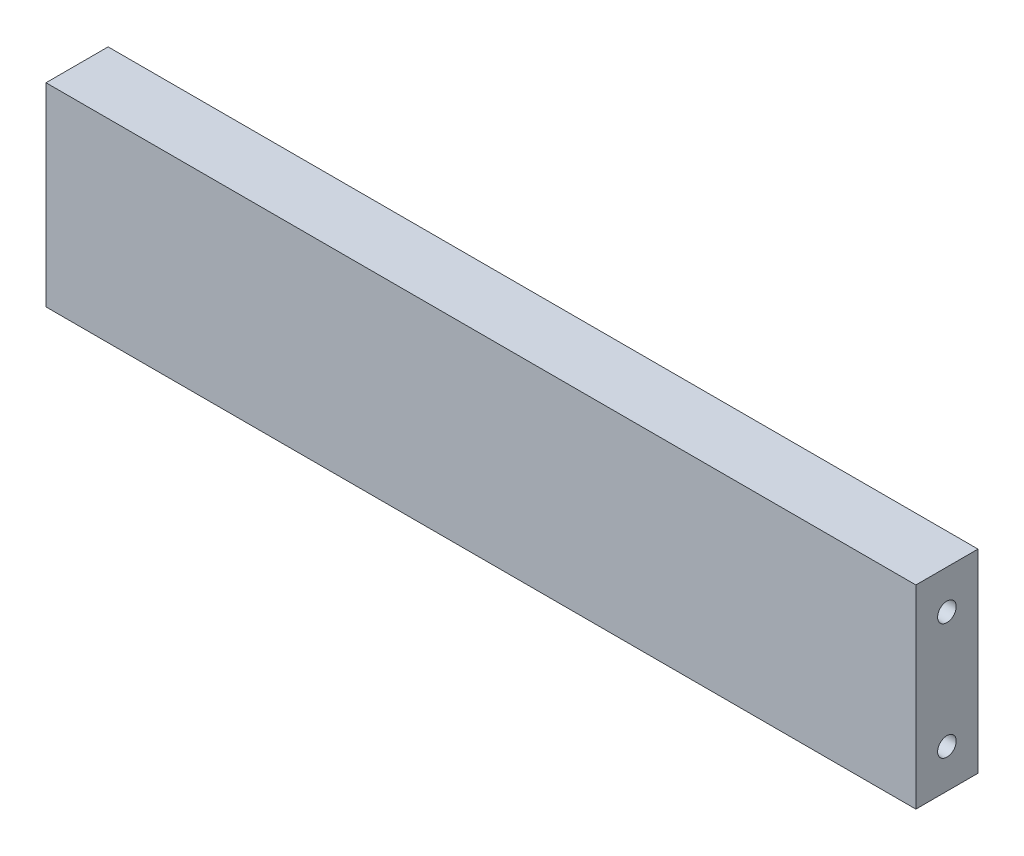
ISO-10303-21;
HEADER;
FILE_DESCRIPTION(('STEP AP214'),'2;1');
FILE_NAME('part.step','',(''),(''),'','','');
FILE_SCHEMA(('AUTOMOTIVE_DESIGN { 1 0 10303 214 1 1 1 1 }'));
ENDSEC;
DATA;
#1=APPLICATION_CONTEXT('core data for automotive mechanical design processes');
#2=APPLICATION_PROTOCOL_DEFINITION('international standard','automotive_design',2000,#1);
#3=PRODUCT_CONTEXT('',#1,'mechanical');
#4=PRODUCT('Part','Part','',(#3));
#5=PRODUCT_RELATED_PRODUCT_CATEGORY('part','',(#4));
#6=PRODUCT_DEFINITION_FORMATION('','',#4);
#7=PRODUCT_DEFINITION_CONTEXT('part definition',#1,'design');
#8=PRODUCT_DEFINITION('design','',#6,#7);
#9=PRODUCT_DEFINITION_SHAPE('','',#8);
#10=(LENGTH_UNIT() NAMED_UNIT(*) SI_UNIT(.MILLI.,.METRE.));
#11=(NAMED_UNIT(*) PLANE_ANGLE_UNIT() SI_UNIT($,.RADIAN.));
#12=(NAMED_UNIT(*) SI_UNIT($,.STERADIAN.) SOLID_ANGLE_UNIT());
#13=UNCERTAINTY_MEASURE_WITH_UNIT(LENGTH_MEASURE(1.E-05),#10,'distance_accuracy_value','');
#14=(GEOMETRIC_REPRESENTATION_CONTEXT(3) GLOBAL_UNCERTAINTY_ASSIGNED_CONTEXT((#13)) GLOBAL_UNIT_ASSIGNED_CONTEXT((#10,
#11,#12)) REPRESENTATION_CONTEXT('',''));
#15=CARTESIAN_POINT('',(0.,0.,0.));
#16=DIRECTION('',(0.,0.,1.));
#17=DIRECTION('',(1.,0.,0.));
#18=AXIS2_PLACEMENT_3D('',#15,#16,#17);
#19=CARTESIAN_POINT('',(0.,0.,8.));
#20=DIRECTION('',(-1.,0.,0.));
#21=DIRECTION('',(0.,-1.,0.));
#22=AXIS2_PLACEMENT_3D('',#19,#20,#21);
#23=PLANE('',#22);
#24=CARTESIAN_POINT('',(0.,5.00000000000002,4.));
#25=DIRECTION('',(-1.,0.,0.));
#26=DIRECTION('',(0.,-1.,0.));
#27=AXIS2_PLACEMENT_3D('',#24,#25,#26);
#28=CIRCLE('',#27,1.2);
#29=CARTESIAN_POINT('',(0.,3.80000000000002,4.));
#30=VERTEX_POINT('',#29);
#31=EDGE_CURVE('E131',#30,#30,#28,.T.);
#32=ORIENTED_EDGE('',*,*,#31,.F.);
#33=EDGE_LOOP('',(#32));
#34=FACE_BOUND('',#33,.T.);
#35=CARTESIAN_POINT('',(0.,20.,4.));
#36=DIRECTION('',(-1.,0.,0.));
#37=DIRECTION('',(0.,-1.,0.));
#38=AXIS2_PLACEMENT_3D('',#35,#36,#37);
#39=CIRCLE('',#38,1.2);
#40=CARTESIAN_POINT('',(0.,18.8,4.));
#41=VERTEX_POINT('',#40);
#42=EDGE_CURVE('E134',#41,#41,#39,.T.);
#43=ORIENTED_EDGE('',*,*,#42,.F.);
#44=EDGE_LOOP('',(#43));
#45=FACE_BOUND('',#44,.T.);
#46=DIRECTION('',(0.,1.,0.));
#47=VECTOR('',#46,1.);
#48=CARTESIAN_POINT('',(0.,0.,0.));
#49=LINE('',#48,#47);
#50=CARTESIAN_POINT('',(0.,0.,0.));
#51=VERTEX_POINT('',#50);
#52=CARTESIAN_POINT('',(0.,25.,0.));
#53=VERTEX_POINT('',#52);
#54=EDGE_CURVE('E76',#51,#53,#49,.T.);
#55=ORIENTED_EDGE('',*,*,#54,.F.);
#56=DIRECTION('',(0.,0.,-1.));
#57=VECTOR('',#56,1.);
#58=CARTESIAN_POINT('',(0.,0.,8.));
#59=LINE('',#58,#57);
#60=CARTESIAN_POINT('',(0.,0.,8.));
#61=VERTEX_POINT('',#60);
#62=EDGE_CURVE('E11',#61,#51,#59,.T.);
#63=ORIENTED_EDGE('',*,*,#62,.F.);
#64=DIRECTION('',(0.,1.,0.));
#65=VECTOR('',#64,1.);
#66=CARTESIAN_POINT('',(0.,0.,8.));
#67=LINE('',#66,#65);
#68=CARTESIAN_POINT('',(0.,25.,8.));
#69=VERTEX_POINT('',#68);
#70=EDGE_CURVE('E77',#61,#69,#67,.T.);
#71=ORIENTED_EDGE('',*,*,#70,.T.);
#72=DIRECTION('',(0.,0.,-1.));
#73=VECTOR('',#72,1.);
#74=CARTESIAN_POINT('',(0.,25.,8.));
#75=LINE('',#74,#73);
#76=EDGE_CURVE('E37',#69,#53,#75,.T.);
#77=ORIENTED_EDGE('',*,*,#76,.T.);
#78=EDGE_LOOP('',(#55,#63,#71,#77));
#79=FACE_BOUND('',#78,.T.);
#80=ADVANCED_FACE('F34',(#34,#45,#79),#23,.T.);
#81=CARTESIAN_POINT('',(0.,0.,8.));
#82=DIRECTION('',(0.,1.,0.));
#83=DIRECTION('',(-1.,0.,0.));
#84=AXIS2_PLACEMENT_3D('',#81,#82,#83);
#85=PLANE('',#84);
#86=DIRECTION('',(1.,0.,0.));
#87=VECTOR('',#86,1.);
#88=CARTESIAN_POINT('',(0.,0.,0.));
#89=LINE('',#88,#87);
#90=CARTESIAN_POINT('',(112.,0.,0.));
#91=VERTEX_POINT('',#90);
#92=EDGE_CURVE('E92',#51,#91,#89,.T.);
#93=ORIENTED_EDGE('',*,*,#92,.T.);
#94=DIRECTION('',(0.,0.,-1.));
#95=VECTOR('',#94,1.);
#96=CARTESIAN_POINT('',(112.,0.,8.));
#97=LINE('',#96,#95);
#98=CARTESIAN_POINT('',(112.,0.,8.));
#99=VERTEX_POINT('',#98);
#100=EDGE_CURVE('E42',#99,#91,#97,.T.);
#101=ORIENTED_EDGE('',*,*,#100,.F.);
#102=DIRECTION('',(1.,0.,0.));
#103=VECTOR('',#102,1.);
#104=CARTESIAN_POINT('',(0.,0.,8.));
#105=LINE('',#104,#103);
#106=EDGE_CURVE('E55',#61,#99,#105,.T.);
#107=ORIENTED_EDGE('',*,*,#106,.F.);
#108=ORIENTED_EDGE('',*,*,#62,.T.);
#109=EDGE_LOOP('',(#93,#101,#107,#108));
#110=FACE_BOUND('',#109,.T.);
#111=ADVANCED_FACE('F112',(#110),#85,.F.);
#112=CARTESIAN_POINT('',(112.,25.,8.));
#113=DIRECTION('',(1.,0.,0.));
#114=DIRECTION('',(0.,0.,-1.));
#115=AXIS2_PLACEMENT_3D('',#112,#113,#114);
#116=PLANE('',#115);
#117=CARTESIAN_POINT('',(112.,5.,4.));
#118=DIRECTION('',(1.,0.,0.));
#119=DIRECTION('',(0.,0.,-1.));
#120=AXIS2_PLACEMENT_3D('',#117,#118,#119);
#121=CIRCLE('',#120,1.2);
#122=CARTESIAN_POINT('',(112.,5.,2.8));
#123=VERTEX_POINT('',#122);
#124=EDGE_CURVE('E140',#123,#123,#121,.T.);
#125=ORIENTED_EDGE('',*,*,#124,.F.);
#126=EDGE_LOOP('',(#125));
#127=FACE_BOUND('',#126,.T.);
#128=CARTESIAN_POINT('',(112.,20.,4.));
#129=DIRECTION('',(1.,0.,0.));
#130=DIRECTION('',(0.,0.,-1.));
#131=AXIS2_PLACEMENT_3D('',#128,#129,#130);
#132=CIRCLE('',#131,1.2);
#133=CARTESIAN_POINT('',(112.,20.,2.8));
#134=VERTEX_POINT('',#133);
#135=EDGE_CURVE('E96',#134,#134,#132,.T.);
#136=ORIENTED_EDGE('',*,*,#135,.F.);
#137=EDGE_LOOP('',(#136));
#138=FACE_BOUND('',#137,.T.);
#139=DIRECTION('',(0.,-1.,0.));
#140=VECTOR('',#139,1.);
#141=CARTESIAN_POINT('',(112.,25.,0.));
#142=LINE('',#141,#140);
#143=CARTESIAN_POINT('',(112.,25.,0.));
#144=VERTEX_POINT('',#143);
#145=EDGE_CURVE('E87',#144,#91,#142,.T.);
#146=ORIENTED_EDGE('',*,*,#145,.F.);
#147=DIRECTION('',(0.,0.,-1.));
#148=VECTOR('',#147,1.);
#149=CARTESIAN_POINT('',(112.,25.,8.));
#150=LINE('',#149,#148);
#151=CARTESIAN_POINT('',(112.,25.,8.));
#152=VERTEX_POINT('',#151);
#153=EDGE_CURVE('E80',#152,#144,#150,.T.);
#154=ORIENTED_EDGE('',*,*,#153,.F.);
#155=DIRECTION('',(0.,-1.,0.));
#156=VECTOR('',#155,1.);
#157=CARTESIAN_POINT('',(112.,25.,8.));
#158=LINE('',#157,#156);
#159=EDGE_CURVE('E105',#152,#99,#158,.T.);
#160=ORIENTED_EDGE('',*,*,#159,.T.);
#161=ORIENTED_EDGE('',*,*,#100,.T.);
#162=EDGE_LOOP('',(#146,#154,#160,#161));
#163=FACE_BOUND('',#162,.T.);
#164=ADVANCED_FACE('F110',(#127,#138,#163),#116,.T.);
#165=CARTESIAN_POINT('',(112.,25.,8.));
#166=DIRECTION('',(0.,-1.,0.));
#167=DIRECTION('',(1.,0.,0.));
#168=AXIS2_PLACEMENT_3D('',#165,#166,#167);
#169=PLANE('',#168);
#170=DIRECTION('',(-1.,0.,0.));
#171=VECTOR('',#170,1.);
#172=CARTESIAN_POINT('',(112.,25.,0.));
#173=LINE('',#172,#171);
#174=EDGE_CURVE('E82',#144,#53,#173,.T.);
#175=ORIENTED_EDGE('',*,*,#174,.T.);
#176=ORIENTED_EDGE('',*,*,#76,.F.);
#177=DIRECTION('',(-1.,0.,0.));
#178=VECTOR('',#177,1.);
#179=CARTESIAN_POINT('',(112.,25.,8.));
#180=LINE('',#179,#178);
#181=EDGE_CURVE('E103',#152,#69,#180,.T.);
#182=ORIENTED_EDGE('',*,*,#181,.F.);
#183=ORIENTED_EDGE('',*,*,#153,.T.);
#184=EDGE_LOOP('',(#175,#176,#182,#183));
#185=FACE_BOUND('',#184,.T.);
#186=ADVANCED_FACE('F83',(#185),#169,.F.);
#187=CARTESIAN_POINT('',(0.,0.,8.));
#188=DIRECTION('',(0.,0.,-1.));
#189=DIRECTION('',(-1.,0.,0.));
#190=AXIS2_PLACEMENT_3D('',#187,#188,#189);
#191=PLANE('',#190);
#192=ORIENTED_EDGE('',*,*,#70,.F.);
#193=ORIENTED_EDGE('',*,*,#106,.T.);
#194=ORIENTED_EDGE('',*,*,#159,.F.);
#195=ORIENTED_EDGE('',*,*,#181,.T.);
#196=EDGE_LOOP('',(#192,#193,#194,#195));
#197=FACE_BOUND('',#196,.T.);
#198=ADVANCED_FACE('F113',(#197),#191,.F.);
#199=CARTESIAN_POINT('',(0.,0.,0.));
#200=DIRECTION('',(0.,0.,-1.));
#201=DIRECTION('',(-1.,0.,0.));
#202=AXIS2_PLACEMENT_3D('',#199,#200,#201);
#203=PLANE('',#202);
#204=ORIENTED_EDGE('',*,*,#54,.T.);
#205=ORIENTED_EDGE('',*,*,#174,.F.);
#206=ORIENTED_EDGE('',*,*,#145,.T.);
#207=ORIENTED_EDGE('',*,*,#92,.F.);
#208=EDGE_LOOP('',(#204,#205,#206,#207));
#209=FACE_BOUND('',#208,.T.);
#210=ADVANCED_FACE('F90',(#209),#203,.T.);
#211=CARTESIAN_POINT('',(101.,20.,4.));
#212=DIRECTION('',(1.,0.,0.));
#213=DIRECTION('',(0.,0.,-1.));
#214=AXIS2_PLACEMENT_3D('',#211,#212,#213);
#215=CYLINDRICAL_SURFACE('',#214,1.2);
#216=CARTESIAN_POINT('',(101.,20.,4.));
#217=DIRECTION('',(1.,0.,0.));
#218=DIRECTION('',(0.,0.,-1.));
#219=AXIS2_PLACEMENT_3D('',#216,#217,#218);
#220=CIRCLE('',#219,1.2);
#221=CARTESIAN_POINT('',(101.,20.,2.8));
#222=VERTEX_POINT('',#221);
#223=EDGE_CURVE('E93',#222,#222,#220,.T.);
#224=ORIENTED_EDGE('',*,*,#223,.F.);
#225=EDGE_LOOP('',(#224));
#226=FACE_BOUND('',#225,.T.);
#227=ORIENTED_EDGE('',*,*,#135,.T.);
#228=EDGE_LOOP('',(#227));
#229=FACE_BOUND('',#228,.T.);
#230=ADVANCED_FACE('F120',(#226,#229),#215,.F.);
#231=CARTESIAN_POINT('',(101.,20.,4.));
#232=DIRECTION('',(1.,0.,0.));
#233=DIRECTION('',(0.,0.,-1.));
#234=AXIS2_PLACEMENT_3D('',#231,#232,#233);
#235=PLANE('',#234);
#236=ORIENTED_EDGE('',*,*,#223,.T.);
#237=EDGE_LOOP('',(#236));
#238=FACE_BOUND('',#237,.T.);
#239=ADVANCED_FACE('F164',(#238),#235,.T.);
#240=CARTESIAN_POINT('',(101.,5.,4.));
#241=DIRECTION('',(1.,0.,0.));
#242=DIRECTION('',(0.,0.,-1.));
#243=AXIS2_PLACEMENT_3D('',#240,#241,#242);
#244=CYLINDRICAL_SURFACE('',#243,1.2);
#245=CARTESIAN_POINT('',(101.,5.,4.));
#246=DIRECTION('',(1.,0.,0.));
#247=DIRECTION('',(0.,0.,-1.));
#248=AXIS2_PLACEMENT_3D('',#245,#246,#247);
#249=CIRCLE('',#248,1.2);
#250=CARTESIAN_POINT('',(101.,5.,2.8));
#251=VERTEX_POINT('',#250);
#252=EDGE_CURVE('E148',#251,#251,#249,.T.);
#253=ORIENTED_EDGE('',*,*,#252,.F.);
#254=EDGE_LOOP('',(#253));
#255=FACE_BOUND('',#254,.T.);
#256=ORIENTED_EDGE('',*,*,#124,.T.);
#257=EDGE_LOOP('',(#256));
#258=FACE_BOUND('',#257,.T.);
#259=ADVANCED_FACE('F161',(#255,#258),#244,.F.);
#260=CARTESIAN_POINT('',(101.,5.,4.));
#261=DIRECTION('',(1.,0.,0.));
#262=DIRECTION('',(0.,0.,-1.));
#263=AXIS2_PLACEMENT_3D('',#260,#261,#262);
#264=PLANE('',#263);
#265=ORIENTED_EDGE('',*,*,#252,.T.);
#266=EDGE_LOOP('',(#265));
#267=FACE_BOUND('',#266,.T.);
#268=ADVANCED_FACE('F163',(#267),#264,.T.);
#269=CARTESIAN_POINT('',(11.,20.,4.));
#270=DIRECTION('',(-1.,0.,0.));
#271=DIRECTION('',(0.,-1.,0.));
#272=AXIS2_PLACEMENT_3D('',#269,#270,#271);
#273=CYLINDRICAL_SURFACE('',#272,1.2);
#274=CARTESIAN_POINT('',(11.,20.,4.));
#275=DIRECTION('',(-1.,0.,0.));
#276=DIRECTION('',(0.,-1.,0.));
#277=AXIS2_PLACEMENT_3D('',#274,#275,#276);
#278=CIRCLE('',#277,1.2);
#279=CARTESIAN_POINT('',(11.,18.8,4.));
#280=VERTEX_POINT('',#279);
#281=EDGE_CURVE('E136',#280,#280,#278,.T.);
#282=ORIENTED_EDGE('',*,*,#281,.F.);
#283=EDGE_LOOP('',(#282));
#284=FACE_BOUND('',#283,.T.);
#285=ORIENTED_EDGE('',*,*,#42,.T.);
#286=EDGE_LOOP('',(#285));
#287=FACE_BOUND('',#286,.T.);
#288=ADVANCED_FACE('F171',(#284,#287),#273,.F.);
#289=CARTESIAN_POINT('',(11.,20.,4.));
#290=DIRECTION('',(-1.,0.,0.));
#291=DIRECTION('',(0.,-1.,0.));
#292=AXIS2_PLACEMENT_3D('',#289,#290,#291);
#293=PLANE('',#292);
#294=ORIENTED_EDGE('',*,*,#281,.T.);
#295=EDGE_LOOP('',(#294));
#296=FACE_BOUND('',#295,.T.);
#297=ADVANCED_FACE('F210',(#296),#293,.T.);
#298=CARTESIAN_POINT('',(11.,5.00000000000002,4.));
#299=DIRECTION('',(-1.,0.,0.));
#300=DIRECTION('',(0.,-1.,0.));
#301=AXIS2_PLACEMENT_3D('',#298,#299,#300);
#302=CYLINDRICAL_SURFACE('',#301,1.2);
#303=CARTESIAN_POINT('',(11.,5.00000000000002,4.));
#304=DIRECTION('',(-1.,0.,0.));
#305=DIRECTION('',(0.,-1.,0.));
#306=AXIS2_PLACEMENT_3D('',#303,#304,#305);
#307=CIRCLE('',#306,1.2);
#308=CARTESIAN_POINT('',(11.,3.80000000000002,4.));
#309=VERTEX_POINT('',#308);
#310=EDGE_CURVE('E137',#309,#309,#307,.T.);
#311=ORIENTED_EDGE('',*,*,#310,.F.);
#312=EDGE_LOOP('',(#311));
#313=FACE_BOUND('',#312,.T.);
#314=ORIENTED_EDGE('',*,*,#31,.T.);
#315=EDGE_LOOP('',(#314));
#316=FACE_BOUND('',#315,.T.);
#317=ADVANCED_FACE('F221',(#313,#316),#302,.F.);
#318=CARTESIAN_POINT('',(11.,5.00000000000002,4.));
#319=DIRECTION('',(-1.,0.,0.));
#320=DIRECTION('',(0.,-1.,0.));
#321=AXIS2_PLACEMENT_3D('',#318,#319,#320);
#322=PLANE('',#321);
#323=ORIENTED_EDGE('',*,*,#310,.T.);
#324=EDGE_LOOP('',(#323));
#325=FACE_BOUND('',#324,.T.);
#326=ADVANCED_FACE('F231',(#325),#322,.T.);
#327=CLOSED_SHELL('',(#80,#111,#164,#186,#198,#210,#230,#239,#259,#268,#288,#297,#317,#326));
#328=MANIFOLD_SOLID_BREP('B2',#327);
#329=ADVANCED_BREP_SHAPE_REPRESENTATION('',(#18,#328),#14);
#330=SHAPE_DEFINITION_REPRESENTATION(#9,#329);
ENDSEC;
END-ISO-10303-21;
